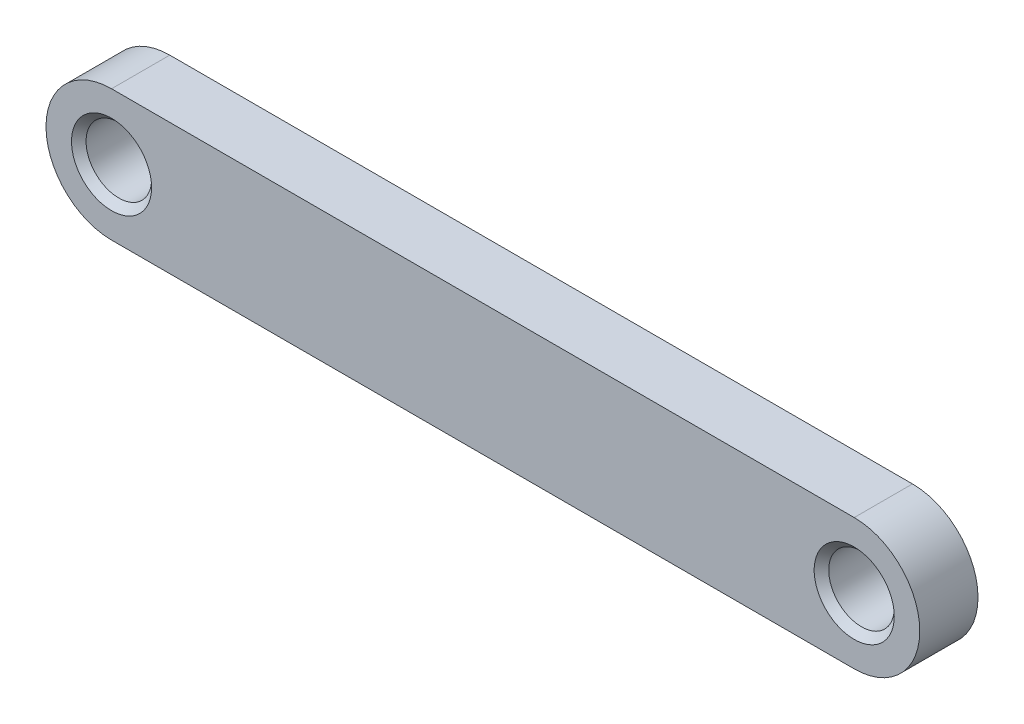
ISO-10303-21;
HEADER;
FILE_DESCRIPTION(('STEP AP214'),'2;1');
FILE_NAME('part.step','',(''),(''),'','','');
FILE_SCHEMA(('AUTOMOTIVE_DESIGN { 1 0 10303 214 1 1 1 1 }'));
ENDSEC;
DATA;
#1=APPLICATION_CONTEXT('core data for automotive mechanical design processes');
#2=APPLICATION_PROTOCOL_DEFINITION('international standard','automotive_design',2000,#1);
#3=PRODUCT_CONTEXT('',#1,'mechanical');
#4=PRODUCT('Part','Part','',(#3));
#5=PRODUCT_RELATED_PRODUCT_CATEGORY('part','',(#4));
#6=PRODUCT_DEFINITION_FORMATION('','',#4);
#7=PRODUCT_DEFINITION_CONTEXT('part definition',#1,'design');
#8=PRODUCT_DEFINITION('design','',#6,#7);
#9=PRODUCT_DEFINITION_SHAPE('','',#8);
#10=(LENGTH_UNIT() NAMED_UNIT(*) SI_UNIT(.MILLI.,.METRE.));
#11=(NAMED_UNIT(*) PLANE_ANGLE_UNIT() SI_UNIT($,.RADIAN.));
#12=(NAMED_UNIT(*) SI_UNIT($,.STERADIAN.) SOLID_ANGLE_UNIT());
#13=UNCERTAINTY_MEASURE_WITH_UNIT(LENGTH_MEASURE(1.E-05),#10,'distance_accuracy_value','');
#14=(GEOMETRIC_REPRESENTATION_CONTEXT(3) GLOBAL_UNCERTAINTY_ASSIGNED_CONTEXT((#13)) GLOBAL_UNIT_ASSIGNED_CONTEXT((#10,
#11,#12)) REPRESENTATION_CONTEXT('',''));
#15=CARTESIAN_POINT('',(0.,0.,0.));
#16=DIRECTION('',(0.,0.,1.));
#17=DIRECTION('',(1.,0.,0.));
#18=AXIS2_PLACEMENT_3D('',#15,#16,#17);
#19=CARTESIAN_POINT('',(0.,0.,8.));
#20=DIRECTION('',(0.,0.,1.));
#21=DIRECTION('',(1.,0.,0.));
#22=AXIS2_PLACEMENT_3D('',#19,#20,#21);
#23=PLANE('',#22);
#24=CARTESIAN_POINT('',(102.,0.,8.));
#25=DIRECTION('',(0.,0.,1.));
#26=DIRECTION('',(1.,0.,0.));
#27=AXIS2_PLACEMENT_3D('',#24,#25,#26);
#28=CIRCLE('',#27,5.50000000000001);
#29=CARTESIAN_POINT('',(107.5,0.,8.));
#30=VERTEX_POINT('',#29);
#31=EDGE_CURVE('E51',#30,#30,#28,.F.);
#32=ORIENTED_EDGE('',*,*,#31,.T.);
#33=EDGE_LOOP('',(#32));
#34=FACE_BOUND('',#33,.T.);
#35=CARTESIAN_POINT('',(0.,0.,8.));
#36=DIRECTION('',(0.,0.,1.));
#37=DIRECTION('',(1.,0.,0.));
#38=AXIS2_PLACEMENT_3D('',#35,#36,#37);
#39=CIRCLE('',#38,5.50000000000001);
#40=CARTESIAN_POINT('',(5.50000000000001,0.,8.));
#41=VERTEX_POINT('',#40);
#42=EDGE_CURVE('E125',#41,#41,#39,.F.);
#43=ORIENTED_EDGE('',*,*,#42,.T.);
#44=EDGE_LOOP('',(#43));
#45=FACE_BOUND('',#44,.T.);
#46=CARTESIAN_POINT('',(0.,0.,8.));
#47=DIRECTION('',(0.,0.,1.));
#48=DIRECTION('',(1.,0.,0.));
#49=AXIS2_PLACEMENT_3D('',#46,#47,#48);
#50=CIRCLE('',#49,9.);
#51=CARTESIAN_POINT('',(0.,9.,8.));
#52=VERTEX_POINT('',#51);
#53=CARTESIAN_POINT('',(0.,-9.,8.));
#54=VERTEX_POINT('',#53);
#55=EDGE_CURVE('E94',#52,#54,#50,.T.);
#56=ORIENTED_EDGE('',*,*,#55,.T.);
#57=DIRECTION('',(1.,0.,0.));
#58=VECTOR('',#57,1.);
#59=CARTESIAN_POINT('',(0.,-9.,8.));
#60=LINE('',#59,#58);
#61=CARTESIAN_POINT('',(102.,-9.,8.));
#62=VERTEX_POINT('',#61);
#63=EDGE_CURVE('E89',#54,#62,#60,.T.);
#64=ORIENTED_EDGE('',*,*,#63,.T.);
#65=CARTESIAN_POINT('',(102.,0.,8.));
#66=DIRECTION('',(0.,0.,1.));
#67=DIRECTION('',(1.,0.,0.));
#68=AXIS2_PLACEMENT_3D('',#65,#66,#67);
#69=CIRCLE('',#68,9.);
#70=CARTESIAN_POINT('',(102.,9.,8.));
#71=VERTEX_POINT('',#70);
#72=EDGE_CURVE('E95',#62,#71,#69,.T.);
#73=ORIENTED_EDGE('',*,*,#72,.T.);
#74=DIRECTION('',(-1.,0.,0.));
#75=VECTOR('',#74,1.);
#76=CARTESIAN_POINT('',(0.,9.,8.));
#77=LINE('',#76,#75);
#78=EDGE_CURVE('E56',#71,#52,#77,.T.);
#79=ORIENTED_EDGE('',*,*,#78,.T.);
#80=EDGE_LOOP('',(#56,#64,#73,#79));
#81=FACE_BOUND('',#80,.T.);
#82=ADVANCED_FACE('F41',(#34,#45,#81),#23,.T.);
#83=CARTESIAN_POINT('',(0.,0.,0.));
#84=DIRECTION('',(0.,0.,1.));
#85=DIRECTION('',(1.,0.,0.));
#86=AXIS2_PLACEMENT_3D('',#83,#84,#85);
#87=PLANE('',#86);
#88=CARTESIAN_POINT('',(0.,0.,0.));
#89=DIRECTION('',(0.,0.,1.));
#90=DIRECTION('',(1.,0.,0.));
#91=AXIS2_PLACEMENT_3D('',#88,#89,#90);
#92=CIRCLE('',#91,9.);
#93=CARTESIAN_POINT('',(0.,9.,0.));
#94=VERTEX_POINT('',#93);
#95=CARTESIAN_POINT('',(0.,-9.,0.));
#96=VERTEX_POINT('',#95);
#97=EDGE_CURVE('E108',#94,#96,#92,.T.);
#98=ORIENTED_EDGE('',*,*,#97,.F.);
#99=DIRECTION('',(-1.,0.,0.));
#100=VECTOR('',#99,1.);
#101=CARTESIAN_POINT('',(0.,9.,0.));
#102=LINE('',#101,#100);
#103=CARTESIAN_POINT('',(102.,9.,0.));
#104=VERTEX_POINT('',#103);
#105=EDGE_CURVE('E85',#104,#94,#102,.T.);
#106=ORIENTED_EDGE('',*,*,#105,.F.);
#107=CARTESIAN_POINT('',(102.,0.,0.));
#108=DIRECTION('',(0.,0.,1.));
#109=DIRECTION('',(1.,0.,0.));
#110=AXIS2_PLACEMENT_3D('',#107,#108,#109);
#111=CIRCLE('',#110,9.);
#112=CARTESIAN_POINT('',(102.,-9.,0.));
#113=VERTEX_POINT('',#112);
#114=EDGE_CURVE('E77',#113,#104,#111,.T.);
#115=ORIENTED_EDGE('',*,*,#114,.F.);
#116=DIRECTION('',(1.,0.,0.));
#117=VECTOR('',#116,1.);
#118=CARTESIAN_POINT('',(0.,-9.,0.));
#119=LINE('',#118,#117);
#120=EDGE_CURVE('E97',#96,#113,#119,.T.);
#121=ORIENTED_EDGE('',*,*,#120,.F.);
#122=EDGE_LOOP('',(#98,#106,#115,#121));
#123=FACE_BOUND('',#122,.T.);
#124=CARTESIAN_POINT('',(0.,0.,0.));
#125=DIRECTION('',(0.,0.,1.));
#126=DIRECTION('',(1.,0.,0.));
#127=AXIS2_PLACEMENT_3D('',#124,#125,#126);
#128=CIRCLE('',#127,4.5);
#129=CARTESIAN_POINT('',(4.5,0.,0.));
#130=VERTEX_POINT('',#129);
#131=EDGE_CURVE('E115',#130,#130,#128,.T.);
#132=ORIENTED_EDGE('',*,*,#131,.T.);
#133=EDGE_LOOP('',(#132));
#134=FACE_BOUND('',#133,.T.);
#135=CARTESIAN_POINT('',(102.,0.,0.));
#136=DIRECTION('',(0.,0.,1.));
#137=DIRECTION('',(1.,0.,0.));
#138=AXIS2_PLACEMENT_3D('',#135,#136,#137);
#139=CIRCLE('',#138,4.5);
#140=CARTESIAN_POINT('',(106.5,0.,0.));
#141=VERTEX_POINT('',#140);
#142=EDGE_CURVE('E143',#141,#141,#139,.T.);
#143=ORIENTED_EDGE('',*,*,#142,.T.);
#144=EDGE_LOOP('',(#143));
#145=FACE_BOUND('',#144,.T.);
#146=ADVANCED_FACE('F146',(#123,#134,#145),#87,.F.);
#147=CARTESIAN_POINT('',(0.,0.,8.));
#148=DIRECTION('',(0.,0.,-1.));
#149=DIRECTION('',(-1.,0.,0.));
#150=AXIS2_PLACEMENT_3D('',#147,#148,#149);
#151=CYLINDRICAL_SURFACE('',#150,9.);
#152=ORIENTED_EDGE('',*,*,#97,.T.);
#153=DIRECTION('',(0.,0.,-1.));
#154=VECTOR('',#153,1.);
#155=CARTESIAN_POINT('',(0.,-9.,8.));
#156=LINE('',#155,#154);
#157=EDGE_CURVE('E99',#54,#96,#156,.T.);
#158=ORIENTED_EDGE('',*,*,#157,.F.);
#159=ORIENTED_EDGE('',*,*,#55,.F.);
#160=DIRECTION('',(0.,0.,-1.));
#161=VECTOR('',#160,1.);
#162=CARTESIAN_POINT('',(0.,9.,8.));
#163=LINE('',#162,#161);
#164=EDGE_CURVE('E104',#52,#94,#163,.T.);
#165=ORIENTED_EDGE('',*,*,#164,.T.);
#166=EDGE_LOOP('',(#152,#158,#159,#165));
#167=FACE_BOUND('',#166,.T.);
#168=ADVANCED_FACE('F162',(#167),#151,.T.);
#169=CARTESIAN_POINT('',(0.,-9.,8.));
#170=DIRECTION('',(0.,1.,0.));
#171=DIRECTION('',(0.,0.,1.));
#172=AXIS2_PLACEMENT_3D('',#169,#170,#171);
#173=PLANE('',#172);
#174=ORIENTED_EDGE('',*,*,#120,.T.);
#175=DIRECTION('',(0.,0.,-1.));
#176=VECTOR('',#175,1.);
#177=CARTESIAN_POINT('',(102.,-9.,8.));
#178=LINE('',#177,#176);
#179=EDGE_CURVE('E100',#62,#113,#178,.T.);
#180=ORIENTED_EDGE('',*,*,#179,.F.);
#181=ORIENTED_EDGE('',*,*,#63,.F.);
#182=ORIENTED_EDGE('',*,*,#157,.T.);
#183=EDGE_LOOP('',(#174,#180,#181,#182));
#184=FACE_BOUND('',#183,.T.);
#185=ADVANCED_FACE('F98',(#184),#173,.F.);
#186=CARTESIAN_POINT('',(102.,0.,8.));
#187=DIRECTION('',(0.,0.,-1.));
#188=DIRECTION('',(-1.,0.,0.));
#189=AXIS2_PLACEMENT_3D('',#186,#187,#188);
#190=CYLINDRICAL_SURFACE('',#189,9.);
#191=ORIENTED_EDGE('',*,*,#114,.T.);
#192=DIRECTION('',(0.,0.,-1.));
#193=VECTOR('',#192,1.);
#194=CARTESIAN_POINT('',(102.,9.,8.));
#195=LINE('',#194,#193);
#196=EDGE_CURVE('E101',#71,#104,#195,.T.);
#197=ORIENTED_EDGE('',*,*,#196,.F.);
#198=ORIENTED_EDGE('',*,*,#72,.F.);
#199=ORIENTED_EDGE('',*,*,#179,.T.);
#200=EDGE_LOOP('',(#191,#197,#198,#199));
#201=FACE_BOUND('',#200,.T.);
#202=ADVANCED_FACE('F103',(#201),#190,.T.);
#203=CARTESIAN_POINT('',(0.,9.,8.));
#204=DIRECTION('',(0.,-1.,0.));
#205=DIRECTION('',(0.,0.,-1.));
#206=AXIS2_PLACEMENT_3D('',#203,#204,#205);
#207=PLANE('',#206);
#208=ORIENTED_EDGE('',*,*,#105,.T.);
#209=ORIENTED_EDGE('',*,*,#164,.F.);
#210=ORIENTED_EDGE('',*,*,#78,.F.);
#211=ORIENTED_EDGE('',*,*,#196,.T.);
#212=EDGE_LOOP('',(#208,#209,#210,#211));
#213=FACE_BOUND('',#212,.T.);
#214=ADVANCED_FACE('F151',(#213),#207,.F.);
#215=CARTESIAN_POINT('',(0.,0.,8.));
#216=DIRECTION('',(0.,0.,-1.));
#217=DIRECTION('',(-1.,0.,0.));
#218=AXIS2_PLACEMENT_3D('',#215,#216,#217);
#219=CYLINDRICAL_SURFACE('',#218,4.5);
#220=CARTESIAN_POINT('',(0.,0.,6.99999999999999));
#221=DIRECTION('',(0.,0.,1.));
#222=DIRECTION('',(1.,0.,0.));
#223=AXIS2_PLACEMENT_3D('',#220,#221,#222);
#224=CIRCLE('',#223,4.5);
#225=CARTESIAN_POINT('',(4.5,0.,6.99999999999999));
#226=VERTEX_POINT('',#225);
#227=EDGE_CURVE('E11',#226,#226,#224,.T.);
#228=ORIENTED_EDGE('',*,*,#227,.T.);
#229=EDGE_LOOP('',(#228));
#230=FACE_BOUND('',#229,.T.);
#231=ORIENTED_EDGE('',*,*,#131,.F.);
#232=EDGE_LOOP('',(#231));
#233=FACE_BOUND('',#232,.T.);
#234=ADVANCED_FACE('F140',(#230,#233),#219,.F.);
#235=CARTESIAN_POINT('',(102.,0.,8.));
#236=DIRECTION('',(0.,0.,-1.));
#237=DIRECTION('',(-1.,0.,0.));
#238=AXIS2_PLACEMENT_3D('',#235,#236,#237);
#239=CYLINDRICAL_SURFACE('',#238,4.5);
#240=CARTESIAN_POINT('',(102.,0.,7.));
#241=DIRECTION('',(0.,0.,1.));
#242=DIRECTION('',(1.,0.,0.));
#243=AXIS2_PLACEMENT_3D('',#240,#241,#242);
#244=CIRCLE('',#243,4.5);
#245=CARTESIAN_POINT('',(106.5,0.,7.));
#246=VERTEX_POINT('',#245);
#247=EDGE_CURVE('E116',#246,#246,#244,.T.);
#248=ORIENTED_EDGE('',*,*,#247,.T.);
#249=EDGE_LOOP('',(#248));
#250=FACE_BOUND('',#249,.T.);
#251=ORIENTED_EDGE('',*,*,#142,.F.);
#252=EDGE_LOOP('',(#251));
#253=FACE_BOUND('',#252,.T.);
#254=ADVANCED_FACE('F135',(#250,#253),#239,.F.);
#255=CARTESIAN_POINT('',(102.,0.,7.));
#256=DIRECTION('',(0.,0.,1.));
#257=DIRECTION('',(1.,0.,0.));
#258=AXIS2_PLACEMENT_3D('',#255,#256,#257);
#259=CONICAL_SURFACE('',#258,4.5,0.785398163397447);
#260=ORIENTED_EDGE('',*,*,#31,.F.);
#261=EDGE_LOOP('',(#260));
#262=FACE_BOUND('',#261,.T.);
#263=ORIENTED_EDGE('',*,*,#247,.F.);
#264=EDGE_LOOP('',(#263));
#265=FACE_BOUND('',#264,.T.);
#266=ADVANCED_FACE('F129',(#262,#265),#259,.F.);
#267=CARTESIAN_POINT('',(0.,0.,6.99999999999999));
#268=DIRECTION('',(0.,0.,1.));
#269=DIRECTION('',(1.,0.,0.));
#270=AXIS2_PLACEMENT_3D('',#267,#268,#269);
#271=CONICAL_SURFACE('',#270,4.5,0.785398163397447);
#272=ORIENTED_EDGE('',*,*,#42,.F.);
#273=EDGE_LOOP('',(#272));
#274=FACE_BOUND('',#273,.T.);
#275=ORIENTED_EDGE('',*,*,#227,.F.);
#276=EDGE_LOOP('',(#275));
#277=FACE_BOUND('',#276,.T.);
#278=ADVANCED_FACE('F42',(#274,#277),#271,.F.);
#279=CLOSED_SHELL('',(#82,#146,#168,#185,#202,#214,#234,#254,#266,#278));
#280=MANIFOLD_SOLID_BREP('B2',#279);
#281=ADVANCED_BREP_SHAPE_REPRESENTATION('',(#18,#280),#14);
#282=SHAPE_DEFINITION_REPRESENTATION(#9,#281);
ENDSEC;
END-ISO-10303-21;
